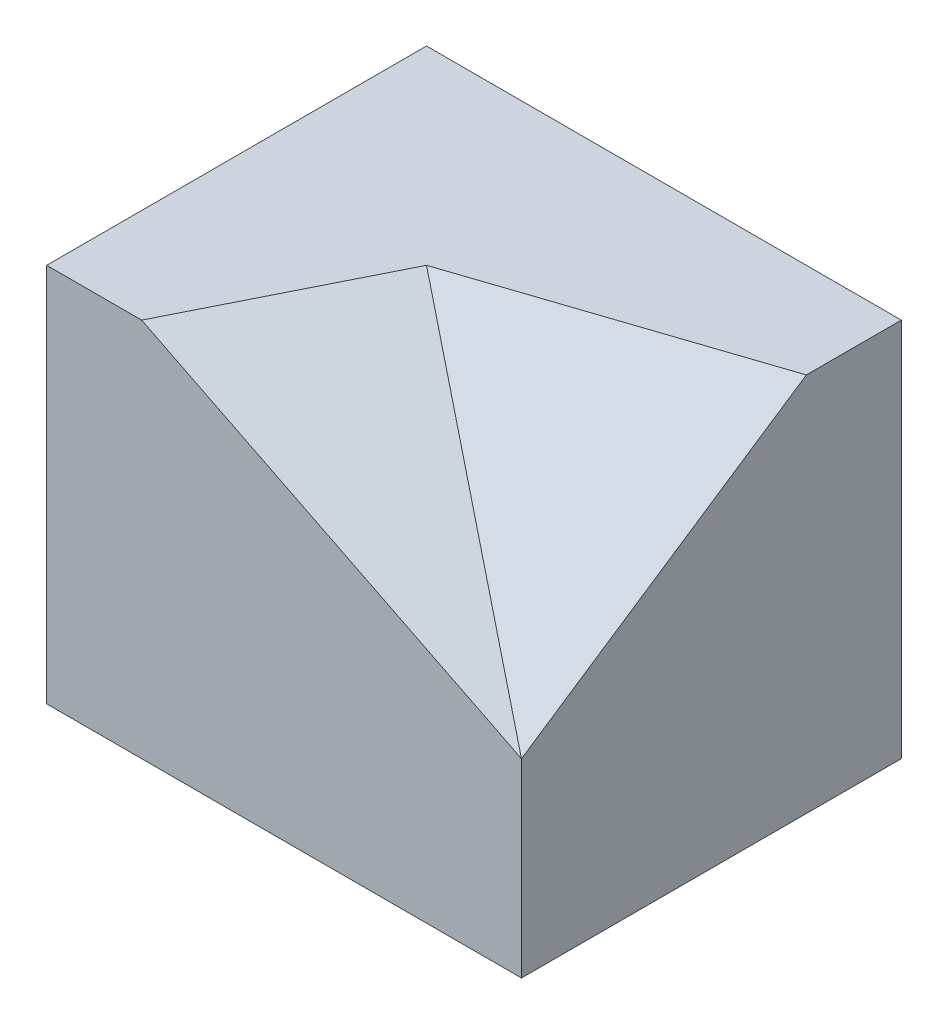
ISO-10303-21;
HEADER;
FILE_DESCRIPTION(('STEP AP214'),'2;1');
FILE_NAME('part.step','',(''),(''),'','','');
FILE_SCHEMA(('AUTOMOTIVE_DESIGN { 1 0 10303 214 1 1 1 1 }'));
ENDSEC;
DATA;
#1=APPLICATION_CONTEXT('core data for automotive mechanical design processes');
#2=APPLICATION_PROTOCOL_DEFINITION('international standard','automotive_design',2000,#1);
#3=PRODUCT_CONTEXT('',#1,'mechanical');
#4=PRODUCT('Part','Part','',(#3));
#5=PRODUCT_RELATED_PRODUCT_CATEGORY('part','',(#4));
#6=PRODUCT_DEFINITION_FORMATION('','',#4);
#7=PRODUCT_DEFINITION_CONTEXT('part definition',#1,'design');
#8=PRODUCT_DEFINITION('design','',#6,#7);
#9=PRODUCT_DEFINITION_SHAPE('','',#8);
#10=(LENGTH_UNIT() NAMED_UNIT(*) SI_UNIT(.MILLI.,.METRE.));
#11=(NAMED_UNIT(*) PLANE_ANGLE_UNIT() SI_UNIT($,.RADIAN.));
#12=(NAMED_UNIT(*) SI_UNIT($,.STERADIAN.) SOLID_ANGLE_UNIT());
#13=UNCERTAINTY_MEASURE_WITH_UNIT(LENGTH_MEASURE(1.E-05),#10,'distance_accuracy_value','');
#14=(GEOMETRIC_REPRESENTATION_CONTEXT(3) GLOBAL_UNCERTAINTY_ASSIGNED_CONTEXT((#13)) GLOBAL_UNIT_ASSIGNED_CONTEXT((#10,
#11,#12)) REPRESENTATION_CONTEXT('',''));
#15=CARTESIAN_POINT('',(0.,0.,0.));
#16=DIRECTION('',(0.,0.,1.));
#17=DIRECTION('',(1.,0.,0.));
#18=AXIS2_PLACEMENT_3D('',#15,#16,#17);
#19=CARTESIAN_POINT('',(-25.,40.,20.));
#20=DIRECTION('',(0.,0.,-1.));
#21=DIRECTION('',(-1.,0.,0.));
#22=AXIS2_PLACEMENT_3D('',#19,#20,#21);
#23=PLANE('',#22);
#24=DIRECTION('',(0.894427190999916,-0.447213595499958,0.));
#25=VECTOR('',#24,1.);
#26=CARTESIAN_POINT('',(-15.,40.,20.));
#27=LINE('',#26,#25);
#28=CARTESIAN_POINT('',(-15.,40.,20.));
#29=VERTEX_POINT('',#28);
#30=CARTESIAN_POINT('',(25.,20.,20.));
#31=VERTEX_POINT('',#30);
#32=EDGE_CURVE('E111',#29,#31,#27,.T.);
#33=ORIENTED_EDGE('',*,*,#32,.F.);
#34=DIRECTION('',(1.,0.,0.));
#35=VECTOR('',#34,1.);
#36=CARTESIAN_POINT('',(-25.,40.,20.));
#37=LINE('',#36,#35);
#38=CARTESIAN_POINT('',(-25.,40.,20.));
#39=VERTEX_POINT('',#38);
#40=EDGE_CURVE('E120',#39,#29,#37,.T.);
#41=ORIENTED_EDGE('',*,*,#40,.F.);
#42=DIRECTION('',(0.,-1.,0.));
#43=VECTOR('',#42,1.);
#44=CARTESIAN_POINT('',(-25.,40.,20.));
#45=LINE('',#44,#43);
#46=CARTESIAN_POINT('',(-25.,0.,20.));
#47=VERTEX_POINT('',#46);
#48=EDGE_CURVE('E129',#39,#47,#45,.T.);
#49=ORIENTED_EDGE('',*,*,#48,.T.);
#50=DIRECTION('',(1.,0.,0.));
#51=VECTOR('',#50,1.);
#52=CARTESIAN_POINT('',(-25.,0.,20.));
#53=LINE('',#52,#51);
#54=CARTESIAN_POINT('',(25.,0.,20.));
#55=VERTEX_POINT('',#54);
#56=EDGE_CURVE('E149',#47,#55,#53,.T.);
#57=ORIENTED_EDGE('',*,*,#56,.T.);
#58=DIRECTION('',(0.,-1.,0.));
#59=VECTOR('',#58,1.);
#60=CARTESIAN_POINT('',(25.,40.,20.));
#61=LINE('',#60,#59);
#62=EDGE_CURVE('E92',#31,#55,#61,.T.);
#63=ORIENTED_EDGE('',*,*,#62,.F.);
#64=EDGE_LOOP('',(#33,#41,#49,#57,#63));
#65=FACE_BOUND('',#64,.T.);
#66=ADVANCED_FACE('F43',(#65),#23,.F.);
#67=CARTESIAN_POINT('',(25.,40.,-20.));
#68=DIRECTION('',(-1.,0.,0.));
#69=DIRECTION('',(0.,0.,1.));
#70=AXIS2_PLACEMENT_3D('',#67,#68,#69);
#71=PLANE('',#70);
#72=DIRECTION('',(0.,0.,-1.));
#73=VECTOR('',#72,1.);
#74=CARTESIAN_POINT('',(25.,40.,-20.));
#75=LINE('',#74,#73);
#76=CARTESIAN_POINT('',(25.,40.,-10.));
#77=VERTEX_POINT('',#76);
#78=CARTESIAN_POINT('',(25.,40.,-20.));
#79=VERTEX_POINT('',#78);
#80=EDGE_CURVE('E96',#77,#79,#75,.T.);
#81=ORIENTED_EDGE('',*,*,#80,.F.);
#82=DIRECTION('',(0.,-0.554700196225229,0.832050294337844));
#83=VECTOR('',#82,1.);
#84=CARTESIAN_POINT('',(25.,40.,-10.));
#85=LINE('',#84,#83);
#86=EDGE_CURVE('E122',#77,#31,#85,.T.);
#87=ORIENTED_EDGE('',*,*,#86,.T.);
#88=ORIENTED_EDGE('',*,*,#62,.T.);
#89=DIRECTION('',(0.,0.,-1.));
#90=VECTOR('',#89,1.);
#91=CARTESIAN_POINT('',(25.,0.,-20.));
#92=LINE('',#91,#90);
#93=CARTESIAN_POINT('',(25.,0.,-20.));
#94=VERTEX_POINT('',#93);
#95=EDGE_CURVE('E140',#55,#94,#92,.T.);
#96=ORIENTED_EDGE('',*,*,#95,.T.);
#97=DIRECTION('',(0.,-1.,0.));
#98=VECTOR('',#97,1.);
#99=CARTESIAN_POINT('',(25.,40.,-20.));
#100=LINE('',#99,#98);
#101=EDGE_CURVE('E12',#79,#94,#100,.T.);
#102=ORIENTED_EDGE('',*,*,#101,.F.);
#103=EDGE_LOOP('',(#81,#87,#88,#96,#102));
#104=FACE_BOUND('',#103,.T.);
#105=ADVANCED_FACE('F45',(#104),#71,.F.);
#106=CARTESIAN_POINT('',(-25.,40.,-20.));
#107=DIRECTION('',(0.,0.,1.));
#108=DIRECTION('',(1.,0.,0.));
#109=AXIS2_PLACEMENT_3D('',#106,#107,#108);
#110=PLANE('',#109);
#111=DIRECTION('',(-1.,0.,0.));
#112=VECTOR('',#111,1.);
#113=CARTESIAN_POINT('',(-25.,0.,-20.));
#114=LINE('',#113,#112);
#115=CARTESIAN_POINT('',(-25.,0.,-20.));
#116=VERTEX_POINT('',#115);
#117=EDGE_CURVE('E143',#94,#116,#114,.T.);
#118=ORIENTED_EDGE('',*,*,#117,.T.);
#119=DIRECTION('',(0.,-1.,0.));
#120=VECTOR('',#119,1.);
#121=CARTESIAN_POINT('',(-25.,40.,-20.));
#122=LINE('',#121,#120);
#123=CARTESIAN_POINT('',(-25.,40.,-20.));
#124=VERTEX_POINT('',#123);
#125=EDGE_CURVE('E54',#124,#116,#122,.T.);
#126=ORIENTED_EDGE('',*,*,#125,.F.);
#127=DIRECTION('',(-1.,0.,0.));
#128=VECTOR('',#127,1.);
#129=CARTESIAN_POINT('',(-25.,40.,-20.));
#130=LINE('',#129,#128);
#131=EDGE_CURVE('E131',#79,#124,#130,.T.);
#132=ORIENTED_EDGE('',*,*,#131,.F.);
#133=ORIENTED_EDGE('',*,*,#101,.T.);
#134=EDGE_LOOP('',(#118,#126,#132,#133));
#135=FACE_BOUND('',#134,.T.);
#136=ADVANCED_FACE('F209',(#135),#110,.F.);
#137=CARTESIAN_POINT('',(-25.,40.,-20.));
#138=DIRECTION('',(1.,0.,0.));
#139=DIRECTION('',(0.,0.,-1.));
#140=AXIS2_PLACEMENT_3D('',#137,#138,#139);
#141=PLANE('',#140);
#142=DIRECTION('',(0.,0.,1.));
#143=VECTOR('',#142,1.);
#144=CARTESIAN_POINT('',(-25.,0.,-20.));
#145=LINE('',#144,#143);
#146=EDGE_CURVE('E146',#116,#47,#145,.T.);
#147=ORIENTED_EDGE('',*,*,#146,.T.);
#148=ORIENTED_EDGE('',*,*,#48,.F.);
#149=DIRECTION('',(0.,0.,1.));
#150=VECTOR('',#149,1.);
#151=CARTESIAN_POINT('',(-25.,40.,-20.));
#152=LINE('',#151,#150);
#153=EDGE_CURVE('E71',#124,#39,#152,.T.);
#154=ORIENTED_EDGE('',*,*,#153,.F.);
#155=ORIENTED_EDGE('',*,*,#125,.T.);
#156=EDGE_LOOP('',(#147,#148,#154,#155));
#157=FACE_BOUND('',#156,.T.);
#158=ADVANCED_FACE('F196',(#157),#141,.F.);
#159=CARTESIAN_POINT('',(0.,40.,0.));
#160=DIRECTION('',(0.,1.,0.));
#161=DIRECTION('',(0.,0.,1.));
#162=AXIS2_PLACEMENT_3D('',#159,#160,#161);
#163=PLANE('',#162);
#164=DIRECTION('',(-0.948683298050514,0.,0.316227766016838));
#165=VECTOR('',#164,1.);
#166=CARTESIAN_POINT('',(25.,40.,-10.));
#167=LINE('',#166,#165);
#168=CARTESIAN_POINT('',(-4.99999999999999,40.,0.));
#169=VERTEX_POINT('',#168);
#170=EDGE_CURVE('E47',#77,#169,#167,.T.);
#171=ORIENTED_EDGE('',*,*,#170,.F.);
#172=ORIENTED_EDGE('',*,*,#80,.T.);
#173=ORIENTED_EDGE('',*,*,#131,.T.);
#174=ORIENTED_EDGE('',*,*,#153,.T.);
#175=ORIENTED_EDGE('',*,*,#40,.T.);
#176=DIRECTION('',(-0.447213595499958,0.,0.894427190999916));
#177=VECTOR('',#176,1.);
#178=CARTESIAN_POINT('',(-4.99999999999998,40.,0.));
#179=LINE('',#178,#177);
#180=EDGE_CURVE('E107',#169,#29,#179,.T.);
#181=ORIENTED_EDGE('',*,*,#180,.F.);
#182=EDGE_LOOP('',(#171,#172,#173,#174,#175,#181));
#183=FACE_BOUND('',#182,.T.);
#184=ADVANCED_FACE('F124',(#183),#163,.T.);
#185=CARTESIAN_POINT('',(0.,0.,0.));
#186=DIRECTION('',(0.,1.,0.));
#187=DIRECTION('',(0.,0.,1.));
#188=AXIS2_PLACEMENT_3D('',#185,#186,#187);
#189=PLANE('',#188);
#190=ORIENTED_EDGE('',*,*,#95,.F.);
#191=ORIENTED_EDGE('',*,*,#56,.F.);
#192=ORIENTED_EDGE('',*,*,#146,.F.);
#193=ORIENTED_EDGE('',*,*,#117,.F.);
#194=EDGE_LOOP('',(#190,#191,#192,#193));
#195=FACE_BOUND('',#194,.T.);
#196=ADVANCED_FACE('F195',(#195),#189,.F.);
#197=CARTESIAN_POINT('',(14.2857142857143,28.5714285714286,7.14285714285715));
#198=DIRECTION('',(-0.436435780471985,-0.872871560943969,-0.218217890235992));
#199=DIRECTION('',(0.894427190999916,-0.447213595499958,0.));
#200=AXIS2_PLACEMENT_3D('',#197,#198,#199);
#201=PLANE('',#200);
#202=DIRECTION('',(0.727606875108999,-0.485071250072666,0.485071250072666));
#203=VECTOR('',#202,1.);
#204=CARTESIAN_POINT('',(-4.99999999999998,40.,0.));
#205=LINE('',#204,#203);
#206=EDGE_CURVE('E112',#169,#31,#205,.T.);
#207=ORIENTED_EDGE('',*,*,#206,.F.);
#208=ORIENTED_EDGE('',*,*,#180,.T.);
#209=ORIENTED_EDGE('',*,*,#32,.T.);
#210=EDGE_LOOP('',(#207,#208,#209));
#211=FACE_BOUND('',#210,.T.);
#212=ADVANCED_FACE('F110',(#211),#201,.F.);
#213=CARTESIAN_POINT('',(5.78512396694215,26.0330578512397,17.3553719008264));
#214=DIRECTION('',(-0.181818181818182,-0.818181818181818,-0.545454545454545));
#215=DIRECTION('',(0.,0.554700196225229,-0.832050294337844));
#216=AXIS2_PLACEMENT_3D('',#213,#214,#215);
#217=PLANE('',#216);
#218=ORIENTED_EDGE('',*,*,#86,.F.);
#219=ORIENTED_EDGE('',*,*,#170,.T.);
#220=ORIENTED_EDGE('',*,*,#206,.T.);
#221=EDGE_LOOP('',(#218,#219,#220));
#222=FACE_BOUND('',#221,.T.);
#223=ADVANCED_FACE('F183',(#222),#217,.F.);
#224=CLOSED_SHELL('',(#66,#105,#136,#158,#184,#196,#212,#223));
#225=MANIFOLD_SOLID_BREP('B2',#224);
#226=ADVANCED_BREP_SHAPE_REPRESENTATION('',(#18,#225),#14);
#227=SHAPE_DEFINITION_REPRESENTATION(#9,#226);
ENDSEC;
END-ISO-10303-21;
